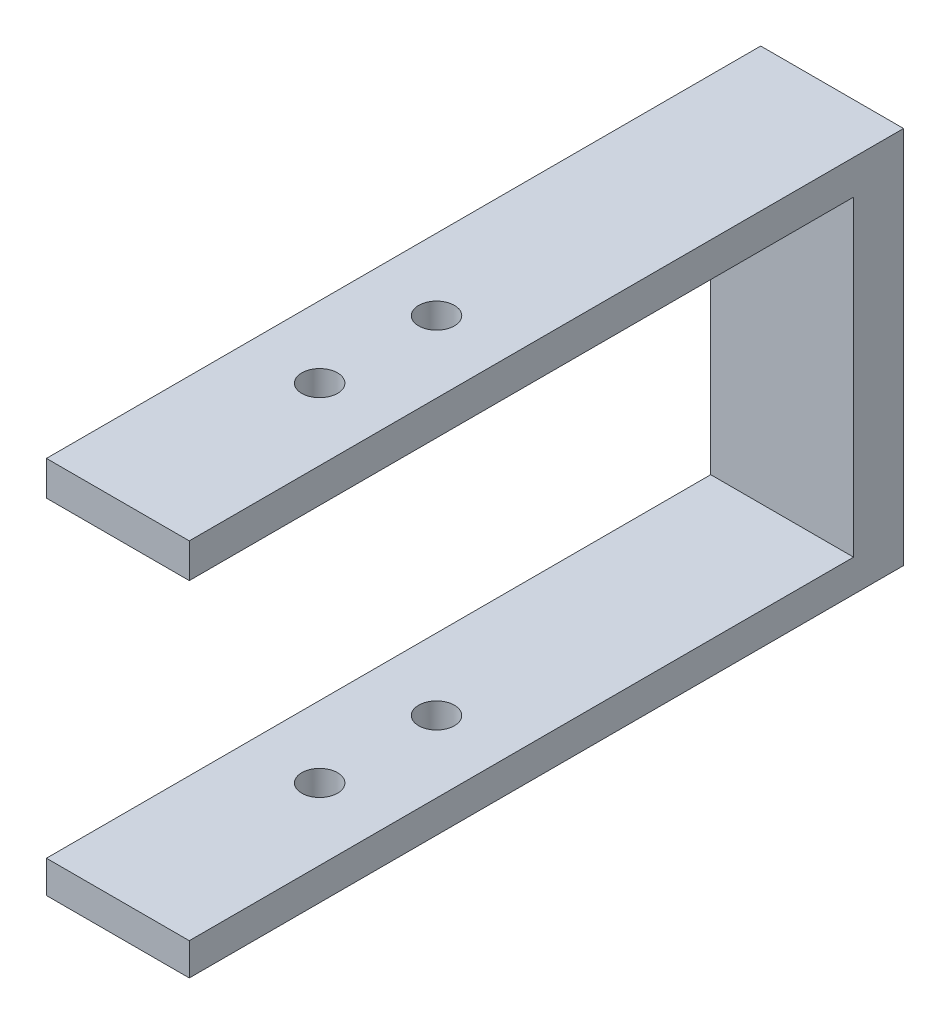
ISO-10303-21;
HEADER;
FILE_DESCRIPTION(('STEP AP214'),'2;1');
FILE_NAME('part.step','',(''),(''),'','','');
FILE_SCHEMA(('AUTOMOTIVE_DESIGN { 1 0 10303 214 1 1 1 1 }'));
ENDSEC;
DATA;
#1=APPLICATION_CONTEXT('core data for automotive mechanical design processes');
#2=APPLICATION_PROTOCOL_DEFINITION('international standard','automotive_design',2000,#1);
#3=PRODUCT_CONTEXT('',#1,'mechanical');
#4=PRODUCT('Part','Part','',(#3));
#5=PRODUCT_RELATED_PRODUCT_CATEGORY('part','',(#4));
#6=PRODUCT_DEFINITION_FORMATION('','',#4);
#7=PRODUCT_DEFINITION_CONTEXT('part definition',#1,'design');
#8=PRODUCT_DEFINITION('design','',#6,#7);
#9=PRODUCT_DEFINITION_SHAPE('','',#8);
#10=(LENGTH_UNIT() NAMED_UNIT(*) SI_UNIT(.MILLI.,.METRE.));
#11=(NAMED_UNIT(*) PLANE_ANGLE_UNIT() SI_UNIT($,.RADIAN.));
#12=(NAMED_UNIT(*) SI_UNIT($,.STERADIAN.) SOLID_ANGLE_UNIT());
#13=UNCERTAINTY_MEASURE_WITH_UNIT(LENGTH_MEASURE(1.E-05),#10,'distance_accuracy_value','');
#14=(GEOMETRIC_REPRESENTATION_CONTEXT(3) GLOBAL_UNCERTAINTY_ASSIGNED_CONTEXT((#13)) GLOBAL_UNIT_ASSIGNED_CONTEXT((#10,
#11,#12)) REPRESENTATION_CONTEXT('',''));
#15=CARTESIAN_POINT('',(0.,0.,0.));
#16=DIRECTION('',(0.,0.,1.));
#17=DIRECTION('',(1.,0.,0.));
#18=AXIS2_PLACEMENT_3D('',#15,#16,#17);
#19=CARTESIAN_POINT('',(-10.,53.,50.));
#20=DIRECTION('',(0.,0.,-1.));
#21=DIRECTION('',(-1.,0.,0.));
#22=AXIS2_PLACEMENT_3D('',#19,#20,#21);
#23=PLANE('',#22);
#24=DIRECTION('',(0.,-1.,0.));
#25=VECTOR('',#24,1.);
#26=CARTESIAN_POINT('',(10.,53.,50.));
#27=LINE('',#26,#25);
#28=CARTESIAN_POINT('',(10.,4.52405347124341,50.));
#29=VERTEX_POINT('',#28);
#30=CARTESIAN_POINT('',(10.,0.,50.));
#31=VERTEX_POINT('',#30);
#32=EDGE_CURVE('E78',#29,#31,#27,.T.);
#33=ORIENTED_EDGE('',*,*,#32,.F.);
#34=DIRECTION('',(1.,0.,0.));
#35=VECTOR('',#34,1.);
#36=CARTESIAN_POINT('',(10.,4.52405347124341,50.));
#37=LINE('',#36,#35);
#38=CARTESIAN_POINT('',(-10.,4.52405347124341,50.));
#39=VERTEX_POINT('',#38);
#40=EDGE_CURVE('E120',#39,#29,#37,.T.);
#41=ORIENTED_EDGE('',*,*,#40,.F.);
#42=DIRECTION('',(0.,-1.,0.));
#43=VECTOR('',#42,1.);
#44=CARTESIAN_POINT('',(-10.,53.,50.));
#45=LINE('',#44,#43);
#46=CARTESIAN_POINT('',(-10.,0.,50.));
#47=VERTEX_POINT('',#46);
#48=EDGE_CURVE('E70',#39,#47,#45,.T.);
#49=ORIENTED_EDGE('',*,*,#48,.T.);
#50=DIRECTION('',(1.,0.,0.));
#51=VECTOR('',#50,1.);
#52=CARTESIAN_POINT('',(-10.,0.,50.));
#53=LINE('',#52,#51);
#54=EDGE_CURVE('E148',#47,#31,#53,.T.);
#55=ORIENTED_EDGE('',*,*,#54,.T.);
#56=EDGE_LOOP('',(#33,#41,#49,#55));
#57=FACE_BOUND('',#56,.T.);
#58=ADVANCED_FACE('F33',(#57),#23,.F.);
#59=CARTESIAN_POINT('',(10.,53.,-50.));
#60=DIRECTION('',(-1.,0.,0.));
#61=DIRECTION('',(0.,0.,1.));
#62=AXIS2_PLACEMENT_3D('',#59,#60,#61);
#63=PLANE('',#62);
#64=CARTESIAN_POINT('',(10.,53.,50.));
#65=VERTEX_POINT('',#64);
#66=CARTESIAN_POINT('',(10.,48.1796211530856,50.));
#67=VERTEX_POINT('',#66);
#68=EDGE_CURVE('E133',#65,#67,#27,.T.);
#69=ORIENTED_EDGE('',*,*,#68,.T.);
#70=DIRECTION('',(0.,0.,1.));
#71=VECTOR('',#70,1.);
#72=CARTESIAN_POINT('',(10.,48.1796211530856,-43.));
#73=LINE('',#72,#71);
#74=CARTESIAN_POINT('',(10.,48.1796211530856,-43.));
#75=VERTEX_POINT('',#74);
#76=EDGE_CURVE('E125',#75,#67,#73,.T.);
#77=ORIENTED_EDGE('',*,*,#76,.F.);
#78=DIRECTION('',(0.,1.,0.));
#79=VECTOR('',#78,1.);
#80=CARTESIAN_POINT('',(10.,4.52405347124341,-43.));
#81=LINE('',#80,#79);
#82=CARTESIAN_POINT('',(10.,4.52405347124341,-43.));
#83=VERTEX_POINT('',#82);
#84=EDGE_CURVE('E112',#83,#75,#81,.T.);
#85=ORIENTED_EDGE('',*,*,#84,.F.);
#86=DIRECTION('',(0.,0.,1.));
#87=VECTOR('',#86,1.);
#88=CARTESIAN_POINT('',(10.,4.52405347124341,-43.));
#89=LINE('',#88,#87);
#90=EDGE_CURVE('E142',#83,#29,#89,.T.);
#91=ORIENTED_EDGE('',*,*,#90,.T.);
#92=ORIENTED_EDGE('',*,*,#32,.T.);
#93=DIRECTION('',(0.,0.,-1.));
#94=VECTOR('',#93,1.);
#95=CARTESIAN_POINT('',(10.,0.,-50.));
#96=LINE('',#95,#94);
#97=CARTESIAN_POINT('',(10.,0.,-50.));
#98=VERTEX_POINT('',#97);
#99=EDGE_CURVE('E144',#31,#98,#96,.T.);
#100=ORIENTED_EDGE('',*,*,#99,.T.);
#101=DIRECTION('',(0.,-1.,0.));
#102=VECTOR('',#101,1.);
#103=CARTESIAN_POINT('',(10.,53.,-50.));
#104=LINE('',#103,#102);
#105=CARTESIAN_POINT('',(10.,53.,-50.));
#106=VERTEX_POINT('',#105);
#107=EDGE_CURVE('E11',#106,#98,#104,.T.);
#108=ORIENTED_EDGE('',*,*,#107,.F.);
#109=DIRECTION('',(0.,0.,-1.));
#110=VECTOR('',#109,1.);
#111=CARTESIAN_POINT('',(10.,53.,-50.));
#112=LINE('',#111,#110);
#113=EDGE_CURVE('E146',#65,#106,#112,.T.);
#114=ORIENTED_EDGE('',*,*,#113,.F.);
#115=EDGE_LOOP('',(#69,#77,#85,#91,#92,#100,#108,#114));
#116=FACE_BOUND('',#115,.T.);
#117=ADVANCED_FACE('F35',(#116),#63,.F.);
#118=CARTESIAN_POINT('',(-10.,53.,-50.));
#119=DIRECTION('',(0.,0.,1.));
#120=DIRECTION('',(1.,0.,0.));
#121=AXIS2_PLACEMENT_3D('',#118,#119,#120);
#122=PLANE('',#121);
#123=DIRECTION('',(-1.,0.,0.));
#124=VECTOR('',#123,1.);
#125=CARTESIAN_POINT('',(-10.,0.,-50.));
#126=LINE('',#125,#124);
#127=CARTESIAN_POINT('',(-10.,0.,-50.));
#128=VERTEX_POINT('',#127);
#129=EDGE_CURVE('E154',#98,#128,#126,.T.);
#130=ORIENTED_EDGE('',*,*,#129,.T.);
#131=DIRECTION('',(0.,-1.,0.));
#132=VECTOR('',#131,1.);
#133=CARTESIAN_POINT('',(-10.,53.,-50.));
#134=LINE('',#133,#132);
#135=CARTESIAN_POINT('',(-10.,53.,-50.));
#136=VERTEX_POINT('',#135);
#137=EDGE_CURVE('E43',#136,#128,#134,.T.);
#138=ORIENTED_EDGE('',*,*,#137,.F.);
#139=DIRECTION('',(-1.,0.,0.));
#140=VECTOR('',#139,1.);
#141=CARTESIAN_POINT('',(-10.,53.,-50.));
#142=LINE('',#141,#140);
#143=EDGE_CURVE('E84',#106,#136,#142,.T.);
#144=ORIENTED_EDGE('',*,*,#143,.F.);
#145=ORIENTED_EDGE('',*,*,#107,.T.);
#146=EDGE_LOOP('',(#130,#138,#144,#145));
#147=FACE_BOUND('',#146,.T.);
#148=ADVANCED_FACE('F193',(#147),#122,.F.);
#149=CARTESIAN_POINT('',(-10.,53.,-50.));
#150=DIRECTION('',(1.,0.,0.));
#151=DIRECTION('',(0.,0.,-1.));
#152=AXIS2_PLACEMENT_3D('',#149,#150,#151);
#153=PLANE('',#152);
#154=DIRECTION('',(0.,-1.,0.));
#155=VECTOR('',#154,1.);
#156=CARTESIAN_POINT('',(-10.,4.52405347124341,-43.));
#157=LINE('',#156,#155);
#158=CARTESIAN_POINT('',(-10.,48.1796211530856,-43.));
#159=VERTEX_POINT('',#158);
#160=CARTESIAN_POINT('',(-10.,4.52405347124341,-43.));
#161=VERTEX_POINT('',#160);
#162=EDGE_CURVE('E119',#159,#161,#157,.T.);
#163=ORIENTED_EDGE('',*,*,#162,.F.);
#164=DIRECTION('',(0.,0.,1.));
#165=VECTOR('',#164,1.);
#166=CARTESIAN_POINT('',(-10.,48.1796211530856,-43.));
#167=LINE('',#166,#165);
#168=CARTESIAN_POINT('',(-10.,48.1796211530856,50.));
#169=VERTEX_POINT('',#168);
#170=EDGE_CURVE('E128',#159,#169,#167,.T.);
#171=ORIENTED_EDGE('',*,*,#170,.T.);
#172=CARTESIAN_POINT('',(-10.,53.,50.));
#173=VERTEX_POINT('',#172);
#174=EDGE_CURVE('E160',#173,#169,#45,.T.);
#175=ORIENTED_EDGE('',*,*,#174,.F.);
#176=DIRECTION('',(0.,0.,1.));
#177=VECTOR('',#176,1.);
#178=CARTESIAN_POINT('',(-10.,53.,-50.));
#179=LINE('',#178,#177);
#180=EDGE_CURVE('E150',#136,#173,#179,.T.);
#181=ORIENTED_EDGE('',*,*,#180,.F.);
#182=ORIENTED_EDGE('',*,*,#137,.T.);
#183=DIRECTION('',(0.,0.,1.));
#184=VECTOR('',#183,1.);
#185=CARTESIAN_POINT('',(-10.,0.,-50.));
#186=LINE('',#185,#184);
#187=EDGE_CURVE('E156',#128,#47,#186,.T.);
#188=ORIENTED_EDGE('',*,*,#187,.T.);
#189=ORIENTED_EDGE('',*,*,#48,.F.);
#190=DIRECTION('',(0.,0.,1.));
#191=VECTOR('',#190,1.);
#192=CARTESIAN_POINT('',(-10.,4.52405347124341,-43.));
#193=LINE('',#192,#191);
#194=EDGE_CURVE('E140',#161,#39,#193,.T.);
#195=ORIENTED_EDGE('',*,*,#194,.F.);
#196=EDGE_LOOP('',(#163,#171,#175,#181,#182,#188,#189,#195));
#197=FACE_BOUND('',#196,.T.);
#198=ADVANCED_FACE('F187',(#197),#153,.F.);
#199=ORIENTED_EDGE('',*,*,#174,.T.);
#200=DIRECTION('',(-1.,0.,0.));
#201=VECTOR('',#200,1.);
#202=CARTESIAN_POINT('',(10.,48.1796211530856,50.));
#203=LINE('',#202,#201);
#204=EDGE_CURVE('E129',#67,#169,#203,.T.);
#205=ORIENTED_EDGE('',*,*,#204,.F.);
#206=ORIENTED_EDGE('',*,*,#68,.F.);
#207=DIRECTION('',(1.,0.,0.));
#208=VECTOR('',#207,1.);
#209=CARTESIAN_POINT('',(-10.,53.,50.));
#210=LINE('',#209,#208);
#211=EDGE_CURVE('E52',#173,#65,#210,.T.);
#212=ORIENTED_EDGE('',*,*,#211,.F.);
#213=EDGE_LOOP('',(#199,#205,#206,#212));
#214=FACE_BOUND('',#213,.T.);
#215=ADVANCED_FACE('F190',(#214),#23,.F.);
#216=CARTESIAN_POINT('',(0.,53.,0.));
#217=DIRECTION('',(0.,1.,0.));
#218=DIRECTION('',(0.,0.,1.));
#219=AXIS2_PLACEMENT_3D('',#216,#217,#218);
#220=PLANE('',#219);
#221=CARTESIAN_POINT('',(0.,53.,21.7488376030168));
#222=DIRECTION('',(0.,1.,0.));
#223=DIRECTION('',(0.,0.,1.));
#224=AXIS2_PLACEMENT_3D('',#221,#222,#223);
#225=CIRCLE('',#224,2.5);
#226=CARTESIAN_POINT('',(0.,53.,24.2488376030168));
#227=VERTEX_POINT('',#226);
#228=EDGE_CURVE('E326',#227,#227,#225,.T.);
#229=ORIENTED_EDGE('',*,*,#228,.F.);
#230=EDGE_LOOP('',(#229));
#231=FACE_BOUND('',#230,.T.);
#232=CARTESIAN_POINT('',(0.,53.,5.38561240630386));
#233=DIRECTION('',(0.,1.,0.));
#234=DIRECTION('',(0.,0.,1.));
#235=AXIS2_PLACEMENT_3D('',#232,#233,#234);
#236=CIRCLE('',#235,2.5);
#237=CARTESIAN_POINT('',(0.,53.,7.88561240630386));
#238=VERTEX_POINT('',#237);
#239=EDGE_CURVE('E167',#238,#238,#236,.T.);
#240=ORIENTED_EDGE('',*,*,#239,.F.);
#241=EDGE_LOOP('',(#240));
#242=FACE_BOUND('',#241,.T.);
#243=ORIENTED_EDGE('',*,*,#113,.T.);
#244=ORIENTED_EDGE('',*,*,#143,.T.);
#245=ORIENTED_EDGE('',*,*,#180,.T.);
#246=ORIENTED_EDGE('',*,*,#211,.T.);
#247=EDGE_LOOP('',(#243,#244,#245,#246));
#248=FACE_BOUND('',#247,.T.);
#249=ADVANCED_FACE('F192',(#231,#242,#248),#220,.T.);
#250=CARTESIAN_POINT('',(0.,0.,0.));
#251=DIRECTION('',(0.,1.,0.));
#252=DIRECTION('',(0.,0.,1.));
#253=AXIS2_PLACEMENT_3D('',#250,#251,#252);
#254=PLANE('',#253);
#255=CARTESIAN_POINT('',(0.,0.,21.7488376030168));
#256=DIRECTION('',(0.,1.,0.));
#257=DIRECTION('',(0.,0.,1.));
#258=AXIS2_PLACEMENT_3D('',#255,#256,#257);
#259=CIRCLE('',#258,2.5);
#260=CARTESIAN_POINT('',(0.,0.,24.2488376030168));
#261=VERTEX_POINT('',#260);
#262=EDGE_CURVE('E174',#261,#261,#259,.T.);
#263=ORIENTED_EDGE('',*,*,#262,.T.);
#264=EDGE_LOOP('',(#263));
#265=FACE_BOUND('',#264,.T.);
#266=CARTESIAN_POINT('',(0.,0.,5.38561240630386));
#267=DIRECTION('',(0.,1.,0.));
#268=DIRECTION('',(0.,0.,1.));
#269=AXIS2_PLACEMENT_3D('',#266,#267,#268);
#270=CIRCLE('',#269,2.5);
#271=CARTESIAN_POINT('',(0.,0.,7.88561240630386));
#272=VERTEX_POINT('',#271);
#273=EDGE_CURVE('E171',#272,#272,#270,.T.);
#274=ORIENTED_EDGE('',*,*,#273,.T.);
#275=EDGE_LOOP('',(#274));
#276=FACE_BOUND('',#275,.T.);
#277=ORIENTED_EDGE('',*,*,#99,.F.);
#278=ORIENTED_EDGE('',*,*,#54,.F.);
#279=ORIENTED_EDGE('',*,*,#187,.F.);
#280=ORIENTED_EDGE('',*,*,#129,.F.);
#281=EDGE_LOOP('',(#277,#278,#279,#280));
#282=FACE_BOUND('',#281,.T.);
#283=ADVANCED_FACE('F198',(#265,#276,#282),#254,.F.);
#284=CARTESIAN_POINT('',(10.,4.52405347124341,-43.));
#285=DIRECTION('',(0.,-1.,0.));
#286=DIRECTION('',(0.,0.,-1.));
#287=AXIS2_PLACEMENT_3D('',#284,#285,#286);
#288=PLANE('',#287);
#289=CARTESIAN_POINT('',(0.,4.52405347124341,21.7488376030168));
#290=DIRECTION('',(0.,-1.,0.));
#291=DIRECTION('',(0.,0.,-1.));
#292=AXIS2_PLACEMENT_3D('',#289,#290,#291);
#293=CIRCLE('',#292,2.5);
#294=CARTESIAN_POINT('',(0.,4.52405347124341,19.2488376030168));
#295=VERTEX_POINT('',#294);
#296=EDGE_CURVE('E179',#295,#295,#293,.T.);
#297=ORIENTED_EDGE('',*,*,#296,.T.);
#298=EDGE_LOOP('',(#297));
#299=FACE_BOUND('',#298,.T.);
#300=CARTESIAN_POINT('',(0.,4.52405347124341,5.38561240630386));
#301=DIRECTION('',(0.,-1.,0.));
#302=DIRECTION('',(0.,0.,-1.));
#303=AXIS2_PLACEMENT_3D('',#300,#301,#302);
#304=CIRCLE('',#303,2.5);
#305=CARTESIAN_POINT('',(0.,4.52405347124341,2.88561240630386));
#306=VERTEX_POINT('',#305);
#307=EDGE_CURVE('E166',#306,#306,#304,.T.);
#308=ORIENTED_EDGE('',*,*,#307,.T.);
#309=EDGE_LOOP('',(#308));
#310=FACE_BOUND('',#309,.T.);
#311=ORIENTED_EDGE('',*,*,#40,.T.);
#312=ORIENTED_EDGE('',*,*,#90,.F.);
#313=DIRECTION('',(1.,0.,0.));
#314=VECTOR('',#313,1.);
#315=CARTESIAN_POINT('',(10.,4.52405347124341,-43.));
#316=LINE('',#315,#314);
#317=EDGE_CURVE('E117',#161,#83,#316,.T.);
#318=ORIENTED_EDGE('',*,*,#317,.F.);
#319=ORIENTED_EDGE('',*,*,#194,.T.);
#320=EDGE_LOOP('',(#311,#312,#318,#319));
#321=FACE_BOUND('',#320,.T.);
#322=ADVANCED_FACE('F200',(#299,#310,#321),#288,.F.);
#323=CARTESIAN_POINT('',(0.,0.,-43.));
#324=DIRECTION('',(0.,0.,1.));
#325=DIRECTION('',(1.,0.,0.));
#326=AXIS2_PLACEMENT_3D('',#323,#324,#325);
#327=PLANE('',#326);
#328=ORIENTED_EDGE('',*,*,#84,.T.);
#329=DIRECTION('',(-1.,0.,0.));
#330=VECTOR('',#329,1.);
#331=CARTESIAN_POINT('',(10.,48.1796211530856,-43.));
#332=LINE('',#331,#330);
#333=EDGE_CURVE('E115',#75,#159,#332,.T.);
#334=ORIENTED_EDGE('',*,*,#333,.T.);
#335=ORIENTED_EDGE('',*,*,#162,.T.);
#336=ORIENTED_EDGE('',*,*,#317,.T.);
#337=EDGE_LOOP('',(#328,#334,#335,#336));
#338=FACE_BOUND('',#337,.T.);
#339=ADVANCED_FACE('F114',(#338),#327,.T.);
#340=CARTESIAN_POINT('',(10.,48.1796211530856,-43.));
#341=DIRECTION('',(0.,1.,0.));
#342=DIRECTION('',(0.,0.,1.));
#343=AXIS2_PLACEMENT_3D('',#340,#341,#342);
#344=PLANE('',#343);
#345=CARTESIAN_POINT('',(0.,48.1796211530856,21.7488376030168));
#346=DIRECTION('',(0.,1.,0.));
#347=DIRECTION('',(0.,0.,1.));
#348=AXIS2_PLACEMENT_3D('',#345,#346,#347);
#349=CIRCLE('',#348,2.5);
#350=CARTESIAN_POINT('',(0.,48.1796211530856,24.2488376030168));
#351=VERTEX_POINT('',#350);
#352=EDGE_CURVE('E37',#351,#351,#349,.T.);
#353=ORIENTED_EDGE('',*,*,#352,.T.);
#354=EDGE_LOOP('',(#353));
#355=FACE_BOUND('',#354,.T.);
#356=CARTESIAN_POINT('',(0.,48.1796211530856,5.38561240630386));
#357=DIRECTION('',(0.,1.,0.));
#358=DIRECTION('',(0.,0.,1.));
#359=AXIS2_PLACEMENT_3D('',#356,#357,#358);
#360=CIRCLE('',#359,2.5);
#361=CARTESIAN_POINT('',(0.,48.1796211530856,7.88561240630386));
#362=VERTEX_POINT('',#361);
#363=EDGE_CURVE('E164',#362,#362,#360,.T.);
#364=ORIENTED_EDGE('',*,*,#363,.T.);
#365=EDGE_LOOP('',(#364));
#366=FACE_BOUND('',#365,.T.);
#367=ORIENTED_EDGE('',*,*,#204,.T.);
#368=ORIENTED_EDGE('',*,*,#170,.F.);
#369=ORIENTED_EDGE('',*,*,#333,.F.);
#370=ORIENTED_EDGE('',*,*,#76,.T.);
#371=EDGE_LOOP('',(#367,#368,#369,#370));
#372=FACE_BOUND('',#371,.T.);
#373=ADVANCED_FACE('F124',(#355,#366,#372),#344,.F.);
#374=CARTESIAN_POINT('',(0.,-17.,5.38561240630386));
#375=DIRECTION('',(0.,1.,0.));
#376=DIRECTION('',(0.,0.,1.));
#377=AXIS2_PLACEMENT_3D('',#374,#375,#376);
#378=CYLINDRICAL_SURFACE('',#377,2.5);
#379=ORIENTED_EDGE('',*,*,#239,.T.);
#380=EDGE_LOOP('',(#379));
#381=FACE_BOUND('',#380,.T.);
#382=ORIENTED_EDGE('',*,*,#363,.F.);
#383=EDGE_LOOP('',(#382));
#384=FACE_BOUND('',#383,.T.);
#385=ADVANCED_FACE('F260',(#381,#384),#378,.F.);
#386=ORIENTED_EDGE('',*,*,#307,.F.);
#387=EDGE_LOOP('',(#386));
#388=FACE_BOUND('',#387,.T.);
#389=ORIENTED_EDGE('',*,*,#273,.F.);
#390=EDGE_LOOP('',(#389));
#391=FACE_BOUND('',#390,.T.);
#392=ADVANCED_FACE('F265',(#388,#391),#378,.F.);
#393=CARTESIAN_POINT('',(0.,-14.,21.7488376030168));
#394=DIRECTION('',(0.,1.,0.));
#395=DIRECTION('',(0.,0.,1.));
#396=AXIS2_PLACEMENT_3D('',#393,#394,#395);
#397=CYLINDRICAL_SURFACE('',#396,2.5);
#398=ORIENTED_EDGE('',*,*,#228,.T.);
#399=EDGE_LOOP('',(#398));
#400=FACE_BOUND('',#399,.T.);
#401=ORIENTED_EDGE('',*,*,#352,.F.);
#402=EDGE_LOOP('',(#401));
#403=FACE_BOUND('',#402,.T.);
#404=ADVANCED_FACE('F274',(#400,#403),#397,.F.);
#405=ORIENTED_EDGE('',*,*,#296,.F.);
#406=EDGE_LOOP('',(#405));
#407=FACE_BOUND('',#406,.T.);
#408=ORIENTED_EDGE('',*,*,#262,.F.);
#409=EDGE_LOOP('',(#408));
#410=FACE_BOUND('',#409,.T.);
#411=ADVANCED_FACE('F306',(#407,#410),#397,.F.);
#412=CLOSED_SHELL('',(#58,#117,#148,#198,#215,#249,#283,#322,#339,#373,#385,#392,#404,#411));
#413=MANIFOLD_SOLID_BREP('B2',#412);
#414=ADVANCED_BREP_SHAPE_REPRESENTATION('',(#18,#413),#14);
#415=SHAPE_DEFINITION_REPRESENTATION(#9,#414);
ENDSEC;
END-ISO-10303-21;
